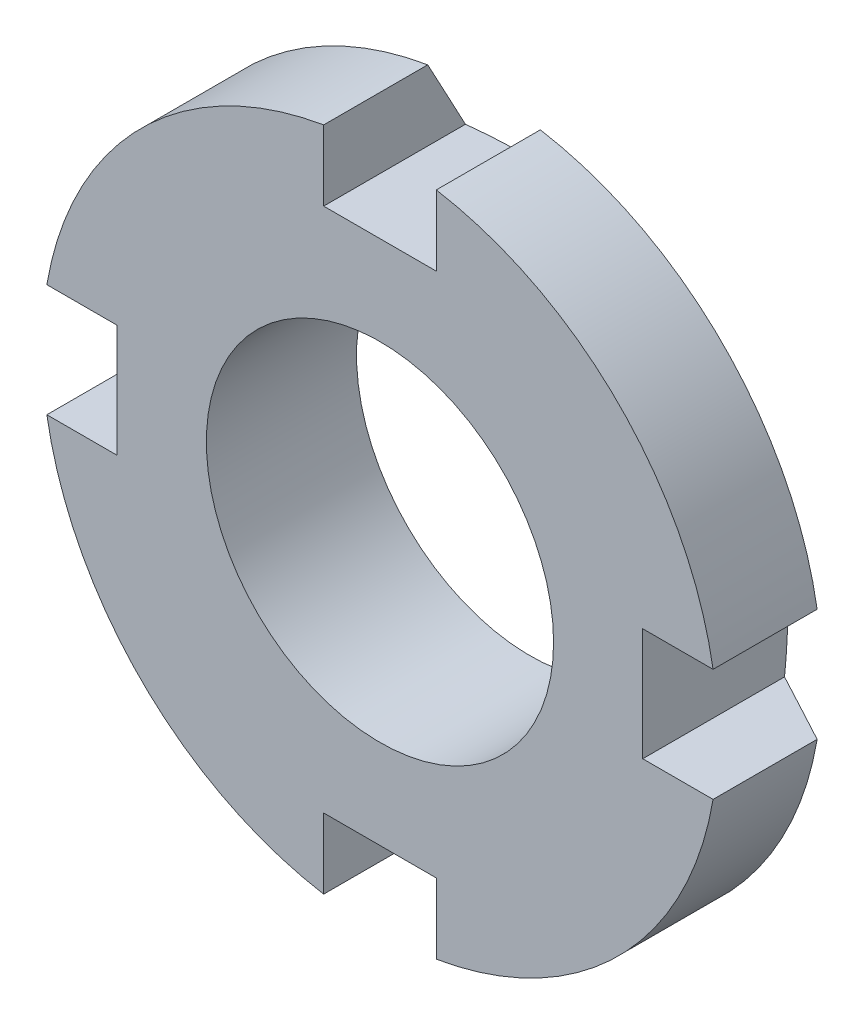
ISO-10303-21;
HEADER;
FILE_DESCRIPTION(('STEP AP214'),'2;1');
FILE_NAME('part.step','',(''),(''),'','','');
FILE_SCHEMA(('AUTOMOTIVE_DESIGN { 1 0 10303 214 1 1 1 1 }'));
ENDSEC;
DATA;
#1=APPLICATION_CONTEXT('core data for automotive mechanical design processes');
#2=APPLICATION_PROTOCOL_DEFINITION('international standard','automotive_design',2000,#1);
#3=PRODUCT_CONTEXT('',#1,'mechanical');
#4=PRODUCT('Part','Part','',(#3));
#5=PRODUCT_RELATED_PRODUCT_CATEGORY('part','',(#4));
#6=PRODUCT_DEFINITION_FORMATION('','',#4);
#7=PRODUCT_DEFINITION_CONTEXT('part definition',#1,'design');
#8=PRODUCT_DEFINITION('design','',#6,#7);
#9=PRODUCT_DEFINITION_SHAPE('','',#8);
#10=(LENGTH_UNIT() NAMED_UNIT(*) SI_UNIT(.MILLI.,.METRE.));
#11=(NAMED_UNIT(*) PLANE_ANGLE_UNIT() SI_UNIT($,.RADIAN.));
#12=(NAMED_UNIT(*) SI_UNIT($,.STERADIAN.) SOLID_ANGLE_UNIT());
#13=UNCERTAINTY_MEASURE_WITH_UNIT(LENGTH_MEASURE(1.E-05),#10,'distance_accuracy_value','');
#14=(GEOMETRIC_REPRESENTATION_CONTEXT(3) GLOBAL_UNCERTAINTY_ASSIGNED_CONTEXT((#13)) GLOBAL_UNIT_ASSIGNED_CONTEXT((#10,
#11,#12)) REPRESENTATION_CONTEXT('',''));
#15=CARTESIAN_POINT('',(0.,0.,0.));
#16=DIRECTION('',(0.,0.,1.));
#17=DIRECTION('',(1.,0.,0.));
#18=AXIS2_PLACEMENT_3D('',#15,#16,#17);
#19=CARTESIAN_POINT('',(0.,0.,4.));
#20=DIRECTION('',(0.,0.,-1.));
#21=DIRECTION('',(-1.,0.,0.));
#22=AXIS2_PLACEMENT_3D('',#19,#20,#21);
#23=CYLINDRICAL_SURFACE('',#22,9.);
#24=CARTESIAN_POINT('',(0.,0.,1.22773147415524));
#25=DIRECTION('',(0.,0.,1.));
#26=DIRECTION('',(1.,0.,0.));
#27=AXIS2_PLACEMENT_3D('',#24,#25,#26);
#28=CIRCLE('',#27,9.);
#29=CARTESIAN_POINT('',(8.87411967464943,1.49999999999997,1.22773147415524));
#30=VERTEX_POINT('',#29);
#31=CARTESIAN_POINT('',(1.5,8.87411967464942,1.22773147415524));
#32=VERTEX_POINT('',#31);
#33=EDGE_CURVE('E158',#30,#32,#28,.T.);
#34=ORIENTED_EDGE('',*,*,#33,.T.);
#35=DIRECTION('',(0.,0.,-1.));
#36=VECTOR('',#35,1.);
#37=CARTESIAN_POINT('',(1.5,8.87411967464942,4.));
#38=LINE('',#37,#36);
#39=CARTESIAN_POINT('',(1.5,8.87411967464942,4.));
#40=VERTEX_POINT('',#39);
#41=EDGE_CURVE('E237',#32,#40,#38,.F.);
#42=ORIENTED_EDGE('',*,*,#41,.T.);
#43=CARTESIAN_POINT('',(0.,0.,4.));
#44=DIRECTION('',(0.,0.,1.));
#45=DIRECTION('',(1.,0.,0.));
#46=AXIS2_PLACEMENT_3D('',#43,#44,#45);
#47=CIRCLE('',#46,9.);
#48=CARTESIAN_POINT('',(8.87411967464943,1.49999999999997,4.));
#49=VERTEX_POINT('',#48);
#50=EDGE_CURVE('E181',#49,#40,#47,.T.);
#51=ORIENTED_EDGE('',*,*,#50,.F.);
#52=DIRECTION('',(0.,0.,-1.));
#53=VECTOR('',#52,1.);
#54=CARTESIAN_POINT('',(8.87411967464943,1.49999999999997,4.));
#55=LINE('',#54,#53);
#56=EDGE_CURVE('E173',#49,#30,#55,.T.);
#57=ORIENTED_EDGE('',*,*,#56,.T.);
#58=EDGE_LOOP('',(#34,#42,#51,#57));
#59=FACE_BOUND('',#58,.T.);
#60=ADVANCED_FACE('F41',(#59),#23,.T.);
#61=CARTESIAN_POINT('',(1.5,-8.87411967464942,1.22773147415524));
#62=VERTEX_POINT('',#61);
#63=CARTESIAN_POINT('',(8.87411967464942,-1.50000000000003,1.22773147415524));
#64=VERTEX_POINT('',#63);
#65=EDGE_CURVE('E168',#62,#64,#28,.T.);
#66=ORIENTED_EDGE('',*,*,#65,.T.);
#67=DIRECTION('',(0.,0.,-1.));
#68=VECTOR('',#67,1.);
#69=CARTESIAN_POINT('',(8.87411967464942,-1.50000000000003,4.));
#70=LINE('',#69,#68);
#71=CARTESIAN_POINT('',(8.87411967464942,-1.50000000000003,4.));
#72=VERTEX_POINT('',#71);
#73=EDGE_CURVE('E187',#64,#72,#70,.F.);
#74=ORIENTED_EDGE('',*,*,#73,.T.);
#75=CARTESIAN_POINT('',(1.5,-8.87411967464942,4.));
#76=VERTEX_POINT('',#75);
#77=EDGE_CURVE('E246',#76,#72,#47,.T.);
#78=ORIENTED_EDGE('',*,*,#77,.F.);
#79=DIRECTION('',(0.,0.,-1.));
#80=VECTOR('',#79,1.);
#81=CARTESIAN_POINT('',(1.5,-8.87411967464942,4.));
#82=LINE('',#81,#80);
#83=EDGE_CURVE('E207',#76,#62,#82,.T.);
#84=ORIENTED_EDGE('',*,*,#83,.T.);
#85=EDGE_LOOP('',(#66,#74,#78,#84));
#86=FACE_BOUND('',#85,.T.);
#87=ADVANCED_FACE('F259',(#86),#23,.T.);
#88=CARTESIAN_POINT('',(-8.87411967464944,-1.49999999999991,1.22773147415524));
#89=VERTEX_POINT('',#88);
#90=CARTESIAN_POINT('',(-1.5,-8.87411967464942,1.22773147415524));
#91=VERTEX_POINT('',#90);
#92=EDGE_CURVE('E420',#89,#91,#28,.T.);
#93=ORIENTED_EDGE('',*,*,#92,.T.);
#94=DIRECTION('',(0.,0.,-1.));
#95=VECTOR('',#94,1.);
#96=CARTESIAN_POINT('',(-1.5,-8.87411967464942,4.));
#97=LINE('',#96,#95);
#98=CARTESIAN_POINT('',(-1.5,-8.87411967464942,4.));
#99=VERTEX_POINT('',#98);
#100=EDGE_CURVE('E202',#91,#99,#97,.F.);
#101=ORIENTED_EDGE('',*,*,#100,.T.);
#102=CARTESIAN_POINT('',(-8.87411967464944,-1.49999999999991,4.));
#103=VERTEX_POINT('',#102);
#104=EDGE_CURVE('E241',#103,#99,#47,.T.);
#105=ORIENTED_EDGE('',*,*,#104,.F.);
#106=DIRECTION('',(0.,0.,-1.));
#107=VECTOR('',#106,1.);
#108=CARTESIAN_POINT('',(-8.87411967464944,-1.49999999999991,4.));
#109=LINE('',#108,#107);
#110=EDGE_CURVE('E195',#103,#89,#109,.T.);
#111=ORIENTED_EDGE('',*,*,#110,.T.);
#112=EDGE_LOOP('',(#93,#101,#105,#111));
#113=FACE_BOUND('',#112,.T.);
#114=ADVANCED_FACE('F410',(#113),#23,.T.);
#115=CARTESIAN_POINT('',(-1.5,8.87411967464942,1.22773147415524));
#116=VERTEX_POINT('',#115);
#117=CARTESIAN_POINT('',(-8.87411967464941,1.50000000000009,1.22773147415524));
#118=VERTEX_POINT('',#117);
#119=EDGE_CURVE('E166',#116,#118,#28,.T.);
#120=ORIENTED_EDGE('',*,*,#119,.T.);
#121=DIRECTION('',(0.,0.,-1.));
#122=VECTOR('',#121,1.);
#123=CARTESIAN_POINT('',(-8.87411967464941,1.50000000000009,4.));
#124=LINE('',#123,#122);
#125=CARTESIAN_POINT('',(-8.87411967464941,1.50000000000009,4.));
#126=VERTEX_POINT('',#125);
#127=EDGE_CURVE('E222',#118,#126,#124,.F.);
#128=ORIENTED_EDGE('',*,*,#127,.T.);
#129=CARTESIAN_POINT('',(-1.5,8.87411967464942,4.));
#130=VERTEX_POINT('',#129);
#131=EDGE_CURVE('E54',#130,#126,#47,.T.);
#132=ORIENTED_EDGE('',*,*,#131,.F.);
#133=DIRECTION('',(0.,0.,-1.));
#134=VECTOR('',#133,1.);
#135=CARTESIAN_POINT('',(-1.5,8.87411967464942,4.));
#136=LINE('',#135,#134);
#137=EDGE_CURVE('E68',#130,#116,#136,.T.);
#138=ORIENTED_EDGE('',*,*,#137,.T.);
#139=EDGE_LOOP('',(#120,#128,#132,#138));
#140=FACE_BOUND('',#139,.T.);
#141=ADVANCED_FACE('F406',(#140),#23,.T.);
#142=CARTESIAN_POINT('',(-1.5,9.,0.));
#143=DIRECTION('',(-1.,0.,0.));
#144=DIRECTION('',(0.,0.,1.));
#145=AXIS2_PLACEMENT_3D('',#142,#143,#144);
#146=PLANE('',#145);
#147=CARTESIAN_POINT('',(-1.5,11.1147770225004,2.43665787458032));
#148=CARTESIAN_POINT('',(-1.5,10.8506556267786,2.29383333471043));
#149=CARTESIAN_POINT('',(-1.5,10.5864971014101,2.15107751910792));
#150=CARTESIAN_POINT('',(-1.5,10.0580846010182,1.86574219561681));
#151=CARTESIAN_POINT('',(-1.5,9.79383062592461,1.72316268785826));
#152=CARTESIAN_POINT('',(-1.5,9.00090068717073,1.29575066054291));
#153=CARTESIAN_POINT('',(-1.5,8.47205035311945,1.01124119699912));
#154=CARTESIAN_POINT('',(-1.5,7.67817594716345,0.585585186568665));
#155=CARTESIAN_POINT('',(-1.5,7.41344956052434,0.443883606077837));
#156=CARTESIAN_POINT('',(-1.5,6.88372268162724,0.16099486320502));
#157=CARTESIAN_POINT('',(-1.5,6.61872218989854,0.0198076998320743));
#158=CARTESIAN_POINT('',(-1.5,6.08834294315433,-0.261863382738055));
#159=CARTESIAN_POINT('',(-1.5,5.82296418353143,-0.40234729327378));
#160=CARTESIAN_POINT('',(-1.5,5.29163272256947,-0.682229224875833));
#161=CARTESIAN_POINT('',(-1.5,5.02568001739623,-0.821627238659087));
#162=CARTESIAN_POINT('',(-1.5,4.75934265214902,-0.960290909987764));
#163=B_SPLINE_CURVE_WITH_KNOTS('',3,(#147,#148,#149,#150,#151,#152,#153,#154,#155,#156,#157,
#158,#159,#160,#161,#162),.UNSPECIFIED.,.F.,.F.,(4,2,2,2,2,2,2,4),(0.,0.900794369729252,
1.80158940352291,3.60315778719345,4.50395399200186,5.40474846062694,6.30555399652662,
7.20636556890652),.UNSPECIFIED.);
#164=CARTESIAN_POINT('',(-1.5,7.,0.223125479913663));
#165=VERTEX_POINT('',#164);
#166=EDGE_CURVE('E215',#116,#165,#163,.T.);
#167=ORIENTED_EDGE('',*,*,#166,.F.);
#168=ORIENTED_EDGE('',*,*,#137,.F.);
#169=DIRECTION('',(0.,-1.,0.));
#170=VECTOR('',#169,1.);
#171=CARTESIAN_POINT('',(-1.5,9.,4.));
#172=LINE('',#171,#170);
#173=CARTESIAN_POINT('',(-1.5,7.,4.));
#174=VERTEX_POINT('',#173);
#175=EDGE_CURVE('E182',#130,#174,#172,.T.);
#176=ORIENTED_EDGE('',*,*,#175,.T.);
#177=DIRECTION('',(0.,0.,1.));
#178=VECTOR('',#177,1.);
#179=CARTESIAN_POINT('',(-1.5,7.,0.));
#180=LINE('',#179,#178);
#181=EDGE_CURVE('E234',#165,#174,#180,.T.);
#182=ORIENTED_EDGE('',*,*,#181,.F.);
#183=EDGE_LOOP('',(#167,#168,#176,#182));
#184=FACE_BOUND('',#183,.T.);
#185=ADVANCED_FACE('F284',(#184),#146,.F.);
#186=CARTESIAN_POINT('',(1.5,9.,0.));
#187=DIRECTION('',(1.,0.,0.));
#188=DIRECTION('',(0.,0.,-1.));
#189=AXIS2_PLACEMENT_3D('',#186,#187,#188);
#190=PLANE('',#189);
#191=CARTESIAN_POINT('',(1.5,4.75934265214902,-0.960290909987764));
#192=CARTESIAN_POINT('',(1.5,4.95578918182487,-0.858036285909096));
#193=CARTESIAN_POINT('',(1.5,5.15201710541849,-0.755363412477248));
#194=CARTESIAN_POINT('',(1.5,5.54412843523637,-0.549363653967655));
#195=CARTESIAN_POINT('',(1.5,5.74001184290889,-0.44603677164763));
#196=CARTESIAN_POINT('',(1.5,6.13152664907411,-0.238911591336168));
#197=CARTESIAN_POINT('',(1.5,6.32715804991903,-0.135113297786346));
#198=CARTESIAN_POINT('',(1.5,6.71822687212564,0.0728485538114658));
#199=CARTESIAN_POINT('',(1.5,6.91366429325136,0.17701211230313));
#200=CARTESIAN_POINT('',(1.5,7.49974627793163,0.489920531797444));
#201=CARTESIAN_POINT('',(1.5,7.89016617098705,0.69908611036567));
#202=CARTESIAN_POINT('',(1.5,8.67062293114549,1.11813212576168));
#203=CARTESIAN_POINT('',(1.5,9.06065979736414,1.32801256423503));
#204=CARTESIAN_POINT('',(1.5,9.72804830001477,1.68767682343232));
#205=CARTESIAN_POINT('',(1.5,10.0054649682038,1.83734000653831));
#206=CARTESIAN_POINT('',(1.5,10.5601932624885,2.13686376678938));
#207=CARTESIAN_POINT('',(1.5,10.8375048881298,2.28672434477614));
#208=CARTESIAN_POINT('',(1.5,11.1147770225004,2.43665787458032));
#209=B_SPLINE_CURVE_WITH_KNOTS('',3,(#191,#192,#193,#194,#195,#196,#197,#198,#199,#200,#201,
#202,#203,#204,#205,#206,#207,#208),.UNSPECIFIED.,.F.,.F.,(4,2,2,2,2,2,2,2,4),(0.,
0.664396750021165,1.3287907003839,1.99317840378869,2.65756691448013,3.98632489271573,
5.31508593173237,6.26072409237568,7.20636629829587),.UNSPECIFIED.);
#210=CARTESIAN_POINT('',(1.50000000000005,7.,0.223125479913541));
#211=VERTEX_POINT('',#210);
#212=EDGE_CURVE('E161',#211,#32,#209,.T.);
#213=ORIENTED_EDGE('',*,*,#212,.F.);
#214=DIRECTION('',(0.,0.,1.));
#215=VECTOR('',#214,1.);
#216=CARTESIAN_POINT('',(1.5,7.,0.));
#217=LINE('',#216,#215);
#218=CARTESIAN_POINT('',(1.5,7.,4.));
#219=VERTEX_POINT('',#218);
#220=EDGE_CURVE('E235',#211,#219,#217,.T.);
#221=ORIENTED_EDGE('',*,*,#220,.T.);
#222=DIRECTION('',(0.,1.,0.));
#223=VECTOR('',#222,1.);
#224=CARTESIAN_POINT('',(1.5,9.,4.));
#225=LINE('',#224,#223);
#226=EDGE_CURVE('E231',#219,#40,#225,.T.);
#227=ORIENTED_EDGE('',*,*,#226,.T.);
#228=ORIENTED_EDGE('',*,*,#41,.F.);
#229=EDGE_LOOP('',(#213,#221,#227,#228));
#230=FACE_BOUND('',#229,.T.);
#231=ADVANCED_FACE('F369',(#230),#190,.F.);
#232=CARTESIAN_POINT('',(-1.5,7.,0.));
#233=DIRECTION('',(0.,-1.,0.));
#234=DIRECTION('',(1.,0.,0.));
#235=AXIS2_PLACEMENT_3D('',#232,#233,#234);
#236=PLANE('',#235);
#237=CARTESIAN_POINT('',(-4.74170035826489,7.,0.930241053757662));
#238=CARTESIAN_POINT('',(-4.51661766252816,7.,0.861389439687649));
#239=CARTESIAN_POINT('',(-4.29062245850839,7.,0.795567166900741));
#240=CARTESIAN_POINT('',(-3.83652224804282,7.,0.671148152115301));
#241=CARTESIAN_POINT('',(-3.60841613048296,7.,0.612555479008985));
#242=CARTESIAN_POINT('',(-2.91938608907934,7.,0.449130597756766));
#243=CARTESIAN_POINT('',(-2.45522002170282,7.,0.35711763581486));
#244=CARTESIAN_POINT('',(-1.76121125698983,7.,0.253655706299638));
#245=CARTESIAN_POINT('',(-1.53385720237715,7.,0.225123729975927));
#246=CARTESIAN_POINT('',(-1.07797227028221,7.,0.179507495416929));
#247=CARTESIAN_POINT('',(-0.84944136763656,7.,0.162423482994938));
#248=CARTESIAN_POINT('',(-0.392222796727265,7.,0.140391800967802));
#249=CARTESIAN_POINT('',(-0.163536242920058,7.,0.135421233014639));
#250=CARTESIAN_POINT('',(0.293755153933356,7.,0.137738430363595));
#251=CARTESIAN_POINT('',(0.52236000033577,7.,0.145025615260545));
#252=CARTESIAN_POINT('',(1.08560351675086,7.,0.177810169223396));
#253=CARTESIAN_POINT('',(1.41985430671503,7.,0.210227681877856));
#254=CARTESIAN_POINT('',(2.08553601170355,7.,0.298423080432974));
#255=CARTESIAN_POINT('',(2.41696337425082,7.,0.354226925596539));
#256=CARTESIAN_POINT('',(3.08326229709133,7.,0.487009074407224));
#257=CARTESIAN_POINT('',(3.41804321475655,7.,0.564436124824867));
#258=CARTESIAN_POINT('',(3.91688669729832,7.,0.692990371010778));
#259=CARTESIAN_POINT('',(4.08259436039717,7.,0.737904857972981));
#260=CARTESIAN_POINT('',(4.41293329284712,7.,0.831419026121075));
#261=CARTESIAN_POINT('',(4.57756476629598,7.,0.880017985148833));
#262=CARTESIAN_POINT('',(4.74170035826489,7.,0.930241053757661));
#263=B_SPLINE_CURVE_WITH_KNOTS('',3,(#237,#238,#239,#240,#241,#242,#243,#244,#245,#246,#247,
#248,#249,#250,#251,#252,#253,#254,#255,#256,#257,#258,#259,#260,#261,#262),.UNSPECIFIED.,.F.,
.F.,(4,2,2,2,2,2,2,2,2,2,2,2,4),(0.,0.706064845806198,1.41252527685223,2.83006261147122,
3.51723845542402,4.20442905410072,4.89031962806356,5.57617772598988,6.58264694036958,
7.59023632582544,8.62052736446333,9.13555454384541,9.6504810373584),.UNSPECIFIED.);
#264=EDGE_CURVE('E360',#165,#211,#263,.T.);
#265=ORIENTED_EDGE('',*,*,#264,.F.);
#266=ORIENTED_EDGE('',*,*,#181,.T.);
#267=DIRECTION('',(1.,0.,0.));
#268=VECTOR('',#267,1.);
#269=CARTESIAN_POINT('',(-1.5,7.,4.));
#270=LINE('',#269,#268);
#271=EDGE_CURVE('E185',#174,#219,#270,.T.);
#272=ORIENTED_EDGE('',*,*,#271,.T.);
#273=ORIENTED_EDGE('',*,*,#220,.F.);
#274=EDGE_LOOP('',(#265,#266,#272,#273));
#275=FACE_BOUND('',#274,.T.);
#276=ADVANCED_FACE('F365',(#275),#236,.F.);
#277=CARTESIAN_POINT('',(-9.00000000000001,-1.49999999999991,0.));
#278=DIRECTION('',(0.,-1.,0.));
#279=DIRECTION('',(0.,0.,1.));
#280=AXIS2_PLACEMENT_3D('',#277,#278,#279);
#281=PLANE('',#280);
#282=CARTESIAN_POINT('',(-11.1147770225004,-1.49999999999988,2.43665787458032));
#283=CARTESIAN_POINT('',(-10.8506556267786,-1.49999999999989,2.29383333471043));
#284=CARTESIAN_POINT('',(-10.5864971014101,-1.49999999999989,2.15107751910792));
#285=CARTESIAN_POINT('',(-10.0580846010182,-1.49999999999989,1.86574219561681));
#286=CARTESIAN_POINT('',(-9.79383062592462,-1.4999999999999,1.72316268785826));
#287=CARTESIAN_POINT('',(-9.00090068717074,-1.49999999999991,1.29575066054291));
#288=CARTESIAN_POINT('',(-8.47205035311946,-1.49999999999991,1.01124119699912));
#289=CARTESIAN_POINT('',(-7.67817594716347,-1.49999999999992,0.585585186568665));
#290=CARTESIAN_POINT('',(-7.41344956052436,-1.49999999999992,0.443883606077837));
#291=CARTESIAN_POINT('',(-6.88372268162725,-1.49999999999993,0.16099486320502));
#292=CARTESIAN_POINT('',(-6.61872218989855,-1.49999999999993,0.0198076998320744));
#293=CARTESIAN_POINT('',(-6.08834294315434,-1.49999999999994,-0.261863382738055));
#294=CARTESIAN_POINT('',(-5.82296418353144,-1.49999999999994,-0.402347293273781));
#295=CARTESIAN_POINT('',(-5.29163272256949,-1.49999999999994,-0.682229224875834));
#296=CARTESIAN_POINT('',(-5.02568001739625,-1.49999999999995,-0.821627238659088));
#297=CARTESIAN_POINT('',(-4.75934265214904,-1.49999999999995,-0.960290909987764));
#298=B_SPLINE_CURVE_WITH_KNOTS('',3,(#282,#283,#284,#285,#286,#287,#288,#289,#290,#291,#292,
#293,#294,#295,#296,#297),.UNSPECIFIED.,.F.,.F.,(4,2,2,2,2,2,2,4),(0.,0.900794369729252,
1.80158940352291,3.60315778719345,4.50395399200186,5.40474846062694,6.30555399652662,
7.20636556890652),.UNSPECIFIED.);
#299=CARTESIAN_POINT('',(-7.00000000000002,-1.49999999999993,0.223125479913663));
#300=VERTEX_POINT('',#299);
#301=EDGE_CURVE('E354',#89,#300,#298,.T.);
#302=ORIENTED_EDGE('',*,*,#301,.F.);
#303=ORIENTED_EDGE('',*,*,#110,.F.);
#304=DIRECTION('',(1.,0.,0.));
#305=VECTOR('',#304,1.);
#306=CARTESIAN_POINT('',(-9.00000000000001,-1.49999999999991,4.));
#307=LINE('',#306,#305);
#308=CARTESIAN_POINT('',(-7.00000000000002,-1.49999999999993,4.));
#309=VERTEX_POINT('',#308);
#310=EDGE_CURVE('E224',#103,#309,#307,.T.);
#311=ORIENTED_EDGE('',*,*,#310,.T.);
#312=DIRECTION('',(0.,0.,1.));
#313=VECTOR('',#312,1.);
#314=CARTESIAN_POINT('',(-7.00000000000002,-1.49999999999993,0.));
#315=LINE('',#314,#313);
#316=EDGE_CURVE('E217',#300,#309,#315,.T.);
#317=ORIENTED_EDGE('',*,*,#316,.F.);
#318=EDGE_LOOP('',(#302,#303,#311,#317));
#319=FACE_BOUND('',#318,.T.);
#320=ADVANCED_FACE('F368',(#319),#281,.F.);
#321=CARTESIAN_POINT('',(-8.99999999999998,1.50000000000009,0.));
#322=DIRECTION('',(0.,1.,0.));
#323=DIRECTION('',(0.,0.,-1.));
#324=AXIS2_PLACEMENT_3D('',#321,#322,#323);
#325=PLANE('',#324);
#326=CARTESIAN_POINT('',(-4.759342652149,1.50000000000005,-0.960290909987764));
#327=CARTESIAN_POINT('',(-4.95578918182485,1.50000000000005,-0.858036285909096));
#328=CARTESIAN_POINT('',(-5.15201710541848,1.50000000000005,-0.755363412477248));
#329=CARTESIAN_POINT('',(-5.54412843523636,1.50000000000006,-0.549363653967655));
#330=CARTESIAN_POINT('',(-5.74001184290887,1.50000000000006,-0.44603677164763));
#331=CARTESIAN_POINT('',(-6.1315266490741,1.50000000000006,-0.238911591336168));
#332=CARTESIAN_POINT('',(-6.32715804991901,1.50000000000007,-0.135113297786346));
#333=CARTESIAN_POINT('',(-6.71822687212563,1.50000000000007,0.0728485538114657));
#334=CARTESIAN_POINT('',(-6.91366429325134,1.50000000000007,0.17701211230313));
#335=CARTESIAN_POINT('',(-7.49974627793161,1.50000000000008,0.489920531797444));
#336=CARTESIAN_POINT('',(-7.89016617098703,1.50000000000008,0.69908611036567));
#337=CARTESIAN_POINT('',(-8.67062293114547,1.50000000000009,1.11813212576168));
#338=CARTESIAN_POINT('',(-9.06065979736412,1.5000000000001,1.32801256423503));
#339=CARTESIAN_POINT('',(-9.72804830001476,1.5000000000001,1.68767682343232));
#340=CARTESIAN_POINT('',(-10.0054649682038,1.50000000000011,1.83734000653831));
#341=CARTESIAN_POINT('',(-10.5601932624885,1.50000000000011,2.13686376678938));
#342=CARTESIAN_POINT('',(-10.8375048881298,1.50000000000011,2.28672434477614));
#343=CARTESIAN_POINT('',(-11.1147770225004,1.50000000000012,2.43665787458032));
#344=B_SPLINE_CURVE_WITH_KNOTS('',3,(#326,#327,#328,#329,#330,#331,#332,#333,#334,#335,#336,
#337,#338,#339,#340,#341,#342,#343),.UNSPECIFIED.,.F.,.F.,(4,2,2,2,2,2,2,2,4),(0.,
0.664396750021164,1.3287907003839,1.99317840378869,2.65756691448013,3.98632489271573,
5.31508593173237,6.26072409237568,7.20636629829587),.UNSPECIFIED.);
#345=CARTESIAN_POINT('',(-6.99999999999998,1.50000000000012,0.223125479913541));
#346=VERTEX_POINT('',#345);
#347=EDGE_CURVE('E346',#346,#118,#344,.T.);
#348=ORIENTED_EDGE('',*,*,#347,.F.);
#349=DIRECTION('',(0.,0.,1.));
#350=VECTOR('',#349,1.);
#351=CARTESIAN_POINT('',(-6.99999999999998,1.50000000000007,0.));
#352=LINE('',#351,#350);
#353=CARTESIAN_POINT('',(-6.99999999999998,1.50000000000007,4.));
#354=VERTEX_POINT('',#353);
#355=EDGE_CURVE('E214',#346,#354,#352,.T.);
#356=ORIENTED_EDGE('',*,*,#355,.T.);
#357=DIRECTION('',(-1.,0.,0.));
#358=VECTOR('',#357,1.);
#359=CARTESIAN_POINT('',(-8.99999999999998,1.50000000000009,4.));
#360=LINE('',#359,#358);
#361=EDGE_CURVE('E219',#354,#126,#360,.T.);
#362=ORIENTED_EDGE('',*,*,#361,.T.);
#363=ORIENTED_EDGE('',*,*,#127,.F.);
#364=EDGE_LOOP('',(#348,#356,#362,#363));
#365=FACE_BOUND('',#364,.T.);
#366=ADVANCED_FACE('F376',(#365),#325,.F.);
#367=CARTESIAN_POINT('',(-7.00000000000002,-1.49999999999993,0.));
#368=DIRECTION('',(1.,0.,0.));
#369=DIRECTION('',(0.,1.,0.));
#370=AXIS2_PLACEMENT_3D('',#367,#368,#369);
#371=PLANE('',#370);
#372=CARTESIAN_POINT('',(-7.00000000000005,-4.74170035826481,0.930241053757662));
#373=CARTESIAN_POINT('',(-7.00000000000005,-4.51661766252809,0.861389439687648));
#374=CARTESIAN_POINT('',(-7.00000000000005,-4.29062245850832,0.795567166900741));
#375=CARTESIAN_POINT('',(-7.00000000000004,-3.83652224804274,0.671148152115301));
#376=CARTESIAN_POINT('',(-7.00000000000004,-3.60841613048289,0.612555479008985));
#377=CARTESIAN_POINT('',(-7.00000000000003,-2.91938608907927,0.449130597756766));
#378=CARTESIAN_POINT('',(-7.00000000000002,-2.45522002170275,0.357117635814861));
#379=CARTESIAN_POINT('',(-7.00000000000002,-1.76121125698976,0.253655706299639));
#380=CARTESIAN_POINT('',(-7.00000000000002,-1.53385720237708,0.225123729975927));
#381=CARTESIAN_POINT('',(-7.00000000000001,-1.07797227028214,0.179507495416929));
#382=CARTESIAN_POINT('',(-7.00000000000001,-0.849441367636488,0.162423482994938));
#383=CARTESIAN_POINT('',(-7.,-0.392222796727193,0.140391800967802));
#384=CARTESIAN_POINT('',(-7.,-0.163536242919985,0.135421233014639));
#385=CARTESIAN_POINT('',(-7.,0.293755153933428,0.137738430363595));
#386=CARTESIAN_POINT('',(-6.99999999999999,0.522360000335842,0.145025615260545));
#387=CARTESIAN_POINT('',(-6.99999999999999,1.08560351675093,0.177810169223396));
#388=CARTESIAN_POINT('',(-6.99999999999998,1.41985430671511,0.210227681877855));
#389=CARTESIAN_POINT('',(-6.99999999999998,2.08553601170362,0.298423080432973));
#390=CARTESIAN_POINT('',(-6.99999999999997,2.41696337425089,0.354226925596538));
#391=CARTESIAN_POINT('',(-6.99999999999997,3.0832622970914,0.487009074407224));
#392=CARTESIAN_POINT('',(-6.99999999999996,3.41804321475663,0.564436124824867));
#393=CARTESIAN_POINT('',(-6.99999999999996,3.9168866972984,0.692990371010778));
#394=CARTESIAN_POINT('',(-6.99999999999996,4.08259436039725,0.737904857972981));
#395=CARTESIAN_POINT('',(-6.99999999999995,4.41293329284719,0.831419026121075));
#396=CARTESIAN_POINT('',(-6.99999999999995,4.57756476629605,0.880017985148833));
#397=CARTESIAN_POINT('',(-6.99999999999995,4.74170035826496,0.930241053757661));
#398=B_SPLINE_CURVE_WITH_KNOTS('',3,(#372,#373,#374,#375,#376,#377,#378,#379,#380,#381,#382,
#383,#384,#385,#386,#387,#388,#389,#390,#391,#392,#393,#394,#395,#396,#397),.UNSPECIFIED.,.F.,
.F.,(4,2,2,2,2,2,2,2,2,2,2,2,4),(0.,0.706064845806199,1.41252527685223,2.83006261147122,
3.51723845542402,4.20442905410072,4.89031962806356,5.57617772598988,6.58264694036958,
7.59023632582544,8.62052736446333,9.13555454384541,9.65048103735839),.UNSPECIFIED.);
#399=EDGE_CURVE('E338',#300,#346,#398,.T.);
#400=ORIENTED_EDGE('',*,*,#399,.F.);
#401=ORIENTED_EDGE('',*,*,#316,.T.);
#402=DIRECTION('',(0.,1.,0.));
#403=VECTOR('',#402,1.);
#404=CARTESIAN_POINT('',(-7.00000000000002,-1.49999999999993,4.));
#405=LINE('',#404,#403);
#406=EDGE_CURVE('E211',#309,#354,#405,.T.);
#407=ORIENTED_EDGE('',*,*,#406,.T.);
#408=ORIENTED_EDGE('',*,*,#355,.F.);
#409=EDGE_LOOP('',(#400,#401,#407,#408));
#410=FACE_BOUND('',#409,.T.);
#411=ADVANCED_FACE('F380',(#410),#371,.F.);
#412=CARTESIAN_POINT('',(1.5,-9.,0.));
#413=DIRECTION('',(1.,0.,0.));
#414=DIRECTION('',(0.,0.,1.));
#415=AXIS2_PLACEMENT_3D('',#412,#413,#414);
#416=PLANE('',#415);
#417=CARTESIAN_POINT('',(1.5,-11.1147770225004,2.43665787458032));
#418=CARTESIAN_POINT('',(1.5,-10.8506556267786,2.29383333471043));
#419=CARTESIAN_POINT('',(1.5,-10.5864971014101,2.15107751910792));
#420=CARTESIAN_POINT('',(1.5,-10.0580846010182,1.86574219561681));
#421=CARTESIAN_POINT('',(1.5,-9.79383062592461,1.72316268785826));
#422=CARTESIAN_POINT('',(1.5,-9.00090068717073,1.29575066054291));
#423=CARTESIAN_POINT('',(1.5,-8.47205035311945,1.01124119699912));
#424=CARTESIAN_POINT('',(1.5,-7.67817594716345,0.585585186568665));
#425=CARTESIAN_POINT('',(1.5,-7.41344956052434,0.443883606077837));
#426=CARTESIAN_POINT('',(1.5,-6.88372268162724,0.16099486320502));
#427=CARTESIAN_POINT('',(1.5,-6.61872218989854,0.0198076998320743));
#428=CARTESIAN_POINT('',(1.5,-6.08834294315433,-0.261863382738055));
#429=CARTESIAN_POINT('',(1.5,-5.82296418353143,-0.40234729327378));
#430=CARTESIAN_POINT('',(1.5,-5.29163272256947,-0.682229224875833));
#431=CARTESIAN_POINT('',(1.5,-5.02568001739623,-0.821627238659087));
#432=CARTESIAN_POINT('',(1.5,-4.75934265214902,-0.960290909987764));
#433=B_SPLINE_CURVE_WITH_KNOTS('',3,(#417,#418,#419,#420,#421,#422,#423,#424,#425,#426,#427,
#428,#429,#430,#431,#432),.UNSPECIFIED.,.F.,.F.,(4,2,2,2,2,2,2,4),(0.,0.900794369729252,
1.80158940352291,3.60315778719345,4.50395399200186,5.40474846062694,6.30555399652662,
7.20636556890652),.UNSPECIFIED.);
#434=CARTESIAN_POINT('',(1.5,-7.,0.223125479913663));
#435=VERTEX_POINT('',#434);
#436=EDGE_CURVE('E330',#62,#435,#433,.T.);
#437=ORIENTED_EDGE('',*,*,#436,.F.);
#438=ORIENTED_EDGE('',*,*,#83,.F.);
#439=DIRECTION('',(0.,1.,0.));
#440=VECTOR('',#439,1.);
#441=CARTESIAN_POINT('',(1.5,-9.,4.));
#442=LINE('',#441,#440);
#443=CARTESIAN_POINT('',(1.5,-7.,4.));
#444=VERTEX_POINT('',#443);
#445=EDGE_CURVE('E204',#76,#444,#442,.T.);
#446=ORIENTED_EDGE('',*,*,#445,.T.);
#447=DIRECTION('',(0.,0.,1.));
#448=VECTOR('',#447,1.);
#449=CARTESIAN_POINT('',(1.5,-7.,0.));
#450=LINE('',#449,#448);
#451=EDGE_CURVE('E197',#435,#444,#450,.T.);
#452=ORIENTED_EDGE('',*,*,#451,.F.);
#453=EDGE_LOOP('',(#437,#438,#446,#452));
#454=FACE_BOUND('',#453,.T.);
#455=ADVANCED_FACE('F384',(#454),#416,.F.);
#456=CARTESIAN_POINT('',(-1.5,-9.,0.));
#457=DIRECTION('',(-1.,0.,0.));
#458=DIRECTION('',(0.,0.,-1.));
#459=AXIS2_PLACEMENT_3D('',#456,#457,#458);
#460=PLANE('',#459);
#461=CARTESIAN_POINT('',(-1.5,-4.75934265214902,-0.960290909987764));
#462=CARTESIAN_POINT('',(-1.5,-4.95578918182487,-0.858036285909096));
#463=CARTESIAN_POINT('',(-1.5,-5.15201710541849,-0.755363412477248));
#464=CARTESIAN_POINT('',(-1.5,-5.54412843523637,-0.549363653967655));
#465=CARTESIAN_POINT('',(-1.5,-5.74001184290889,-0.44603677164763));
#466=CARTESIAN_POINT('',(-1.5,-6.13152664907411,-0.238911591336168));
#467=CARTESIAN_POINT('',(-1.5,-6.32715804991903,-0.135113297786346));
#468=CARTESIAN_POINT('',(-1.5,-6.71822687212564,0.0728485538114658));
#469=CARTESIAN_POINT('',(-1.5,-6.91366429325136,0.17701211230313));
#470=CARTESIAN_POINT('',(-1.5,-7.49974627793163,0.489920531797444));
#471=CARTESIAN_POINT('',(-1.5,-7.89016617098705,0.69908611036567));
#472=CARTESIAN_POINT('',(-1.5,-8.67062293114549,1.11813212576168));
#473=CARTESIAN_POINT('',(-1.5,-9.06065979736414,1.32801256423503));
#474=CARTESIAN_POINT('',(-1.5,-9.72804830001477,1.68767682343232));
#475=CARTESIAN_POINT('',(-1.5,-10.0054649682038,1.83734000653831));
#476=CARTESIAN_POINT('',(-1.5,-10.5601932624885,2.13686376678938));
#477=CARTESIAN_POINT('',(-1.5,-10.8375048881298,2.28672434477614));
#478=CARTESIAN_POINT('',(-1.5,-11.1147770225004,2.43665787458032));
#479=B_SPLINE_CURVE_WITH_KNOTS('',3,(#461,#462,#463,#464,#465,#466,#467,#468,#469,#470,#471,
#472,#473,#474,#475,#476,#477,#478),.UNSPECIFIED.,.F.,.F.,(4,2,2,2,2,2,2,2,4),(0.,
0.664396750021164,1.3287907003839,1.99317840378869,2.65756691448013,3.98632489271573,
5.31508593173237,6.26072409237568,7.20636629829587),.UNSPECIFIED.);
#480=CARTESIAN_POINT('',(-1.50000000000005,-7.,0.223125479913541));
#481=VERTEX_POINT('',#480);
#482=EDGE_CURVE('E322',#481,#91,#479,.T.);
#483=ORIENTED_EDGE('',*,*,#482,.F.);
#484=DIRECTION('',(0.,0.,1.));
#485=VECTOR('',#484,1.);
#486=CARTESIAN_POINT('',(-1.5,-7.,0.));
#487=LINE('',#486,#485);
#488=CARTESIAN_POINT('',(-1.5,-7.,4.));
#489=VERTEX_POINT('',#488);
#490=EDGE_CURVE('E194',#481,#489,#487,.T.);
#491=ORIENTED_EDGE('',*,*,#490,.T.);
#492=DIRECTION('',(0.,-1.,0.));
#493=VECTOR('',#492,1.);
#494=CARTESIAN_POINT('',(-1.5,-9.,4.));
#495=LINE('',#494,#493);
#496=EDGE_CURVE('E199',#489,#99,#495,.T.);
#497=ORIENTED_EDGE('',*,*,#496,.T.);
#498=ORIENTED_EDGE('',*,*,#100,.F.);
#499=EDGE_LOOP('',(#483,#491,#497,#498));
#500=FACE_BOUND('',#499,.T.);
#501=ADVANCED_FACE('F388',(#500),#460,.F.);
#502=CARTESIAN_POINT('',(1.5,-7.,0.));
#503=DIRECTION('',(0.,1.,0.));
#504=DIRECTION('',(-1.,0.,0.));
#505=AXIS2_PLACEMENT_3D('',#502,#503,#504);
#506=PLANE('',#505);
#507=CARTESIAN_POINT('',(4.74170035826489,-7.,0.930241053757662));
#508=CARTESIAN_POINT('',(4.51661766252816,-7.,0.861389439687649));
#509=CARTESIAN_POINT('',(4.29062245850839,-7.,0.795567166900741));
#510=CARTESIAN_POINT('',(3.83652224804282,-7.,0.671148152115301));
#511=CARTESIAN_POINT('',(3.60841613048296,-7.,0.612555479008985));
#512=CARTESIAN_POINT('',(2.91938608907934,-7.,0.449130597756766));
#513=CARTESIAN_POINT('',(2.45522002170282,-7.,0.35711763581486));
#514=CARTESIAN_POINT('',(1.76121125698983,-7.,0.253655706299638));
#515=CARTESIAN_POINT('',(1.53385720237715,-7.,0.225123729975927));
#516=CARTESIAN_POINT('',(1.07797227028221,-7.,0.179507495416929));
#517=CARTESIAN_POINT('',(0.84944136763656,-7.,0.162423482994938));
#518=CARTESIAN_POINT('',(0.392222796727265,-7.,0.140391800967802));
#519=CARTESIAN_POINT('',(0.163536242920058,-7.,0.135421233014639));
#520=CARTESIAN_POINT('',(-0.293755153933356,-7.,0.137738430363595));
#521=CARTESIAN_POINT('',(-0.52236000033577,-7.,0.145025615260545));
#522=CARTESIAN_POINT('',(-1.08560351675086,-7.,0.177810169223396));
#523=CARTESIAN_POINT('',(-1.41985430671503,-7.,0.210227681877856));
#524=CARTESIAN_POINT('',(-2.08553601170355,-7.,0.298423080432974));
#525=CARTESIAN_POINT('',(-2.41696337425082,-7.,0.354226925596539));
#526=CARTESIAN_POINT('',(-3.08326229709133,-7.,0.487009074407224));
#527=CARTESIAN_POINT('',(-3.41804321475655,-7.,0.564436124824867));
#528=CARTESIAN_POINT('',(-3.91688669729832,-7.,0.692990371010778));
#529=CARTESIAN_POINT('',(-4.08259436039717,-7.,0.737904857972981));
#530=CARTESIAN_POINT('',(-4.41293329284712,-7.,0.831419026121075));
#531=CARTESIAN_POINT('',(-4.57756476629598,-7.,0.880017985148833));
#532=CARTESIAN_POINT('',(-4.74170035826489,-7.,0.930241053757661));
#533=B_SPLINE_CURVE_WITH_KNOTS('',3,(#507,#508,#509,#510,#511,#512,#513,#514,#515,#516,#517,
#518,#519,#520,#521,#522,#523,#524,#525,#526,#527,#528,#529,#530,#531,#532),.UNSPECIFIED.,.F.,
.F.,(4,2,2,2,2,2,2,2,2,2,2,2,4),(0.,0.706064845806198,1.41252527685223,2.83006261147122,
3.51723845542402,4.20442905410072,4.89031962806356,5.57617772598988,6.58264694036958,
7.59023632582544,8.62052736446333,9.13555454384541,9.6504810373584),.UNSPECIFIED.);
#534=EDGE_CURVE('E176',#435,#481,#533,.T.);
#535=ORIENTED_EDGE('',*,*,#534,.F.);
#536=ORIENTED_EDGE('',*,*,#451,.T.);
#537=DIRECTION('',(-1.,0.,0.));
#538=VECTOR('',#537,1.);
#539=CARTESIAN_POINT('',(1.5,-7.,4.));
#540=LINE('',#539,#538);
#541=EDGE_CURVE('E191',#444,#489,#540,.T.);
#542=ORIENTED_EDGE('',*,*,#541,.T.);
#543=ORIENTED_EDGE('',*,*,#490,.F.);
#544=EDGE_LOOP('',(#535,#536,#542,#543));
#545=FACE_BOUND('',#544,.T.);
#546=ADVANCED_FACE('F392',(#545),#506,.F.);
#547=CARTESIAN_POINT('',(9.00000000000001,1.49999999999997,0.));
#548=DIRECTION('',(0.,1.,0.));
#549=DIRECTION('',(0.,0.,1.));
#550=AXIS2_PLACEMENT_3D('',#547,#548,#549);
#551=PLANE('',#550);
#552=CARTESIAN_POINT('',(11.1147770225004,1.49999999999996,2.43665787458032));
#553=CARTESIAN_POINT('',(10.8506556267786,1.49999999999996,2.29383333471043));
#554=CARTESIAN_POINT('',(10.5864971014101,1.49999999999996,2.15107751910792));
#555=CARTESIAN_POINT('',(10.0580846010182,1.49999999999996,1.86574219561681));
#556=CARTESIAN_POINT('',(9.79383062592461,1.49999999999997,1.72316268785826));
#557=CARTESIAN_POINT('',(9.00090068717073,1.49999999999997,1.29575066054291));
#558=CARTESIAN_POINT('',(8.47205035311945,1.49999999999997,1.01124119699912));
#559=CARTESIAN_POINT('',(7.67817594716346,1.49999999999997,0.585585186568665));
#560=CARTESIAN_POINT('',(7.41344956052435,1.49999999999997,0.443883606077837));
#561=CARTESIAN_POINT('',(6.88372268162724,1.49999999999998,0.16099486320502));
#562=CARTESIAN_POINT('',(6.61872218989854,1.49999999999998,0.0198076998320743));
#563=CARTESIAN_POINT('',(6.08834294315433,1.49999999999998,-0.261863382738056));
#564=CARTESIAN_POINT('',(5.82296418353143,1.49999999999998,-0.402347293273781));
#565=CARTESIAN_POINT('',(5.29163272256948,1.49999999999998,-0.682229224875834));
#566=CARTESIAN_POINT('',(5.02568001739624,1.49999999999998,-0.821627238659088));
#567=CARTESIAN_POINT('',(4.75934265214903,1.49999999999998,-0.960290909987764));
#568=B_SPLINE_CURVE_WITH_KNOTS('',3,(#552,#553,#554,#555,#556,#557,#558,#559,#560,#561,#562,
#563,#564,#565,#566,#567),.UNSPECIFIED.,.F.,.F.,(4,2,2,2,2,2,2,4),(0.,0.900794369729252,
1.80158940352291,3.60315778719345,4.50395399200186,5.40474846062694,6.30555399652662,
7.20636556890652),.UNSPECIFIED.);
#569=CARTESIAN_POINT('',(7.00000000000001,1.49999999999998,0.223125479913662));
#570=VERTEX_POINT('',#569);
#571=EDGE_CURVE('E60',#30,#570,#568,.T.);
#572=ORIENTED_EDGE('',*,*,#571,.F.);
#573=ORIENTED_EDGE('',*,*,#56,.F.);
#574=DIRECTION('',(-1.,0.,0.));
#575=VECTOR('',#574,1.);
#576=CARTESIAN_POINT('',(9.00000000000001,1.49999999999997,4.));
#577=LINE('',#576,#575);
#578=CARTESIAN_POINT('',(7.00000000000001,1.49999999999998,4.));
#579=VERTEX_POINT('',#578);
#580=EDGE_CURVE('E183',#49,#579,#577,.T.);
#581=ORIENTED_EDGE('',*,*,#580,.T.);
#582=DIRECTION('',(0.,0.,1.));
#583=VECTOR('',#582,1.);
#584=CARTESIAN_POINT('',(7.00000000000001,1.49999999999998,0.));
#585=LINE('',#584,#583);
#586=EDGE_CURVE('E175',#570,#579,#585,.T.);
#587=ORIENTED_EDGE('',*,*,#586,.F.);
#588=EDGE_LOOP('',(#572,#573,#581,#587));
#589=FACE_BOUND('',#588,.T.);
#590=ADVANCED_FACE('F171',(#589),#551,.F.);
#591=CARTESIAN_POINT('',(8.99999999999999,-1.50000000000003,0.));
#592=DIRECTION('',(0.,-1.,0.));
#593=DIRECTION('',(0.,0.,-1.));
#594=AXIS2_PLACEMENT_3D('',#591,#592,#593);
#595=PLANE('',#594);
#596=CARTESIAN_POINT('',(4.75934265214901,-1.50000000000002,-0.960290909987764));
#597=CARTESIAN_POINT('',(4.95578918182486,-1.50000000000002,-0.858036285909096));
#598=CARTESIAN_POINT('',(5.15201710541849,-1.50000000000002,-0.755363412477248));
#599=CARTESIAN_POINT('',(5.54412843523637,-1.50000000000002,-0.549363653967655));
#600=CARTESIAN_POINT('',(5.74001184290888,-1.50000000000002,-0.44603677164763));
#601=CARTESIAN_POINT('',(6.13152664907411,-1.50000000000002,-0.238911591336168));
#602=CARTESIAN_POINT('',(6.32715804991902,-1.50000000000002,-0.135113297786346));
#603=CARTESIAN_POINT('',(6.71822687212564,-1.50000000000002,0.0728485538114658));
#604=CARTESIAN_POINT('',(6.91366429325135,-1.50000000000002,0.17701211230313));
#605=CARTESIAN_POINT('',(7.49974627793162,-1.50000000000003,0.489920531797444));
#606=CARTESIAN_POINT('',(7.89016617098704,-1.50000000000003,0.699086110365669));
#607=CARTESIAN_POINT('',(8.67062293114548,-1.50000000000003,1.11813212576168));
#608=CARTESIAN_POINT('',(9.06065979736413,-1.50000000000003,1.32801256423503));
#609=CARTESIAN_POINT('',(9.72804830001477,-1.50000000000003,1.68767682343232));
#610=CARTESIAN_POINT('',(10.0054649682038,-1.50000000000003,1.83734000653831));
#611=CARTESIAN_POINT('',(10.5601932624885,-1.50000000000004,2.13686376678938));
#612=CARTESIAN_POINT('',(10.8375048881298,-1.50000000000004,2.28672434477614));
#613=CARTESIAN_POINT('',(11.1147770225004,-1.50000000000004,2.43665787458032));
#614=B_SPLINE_CURVE_WITH_KNOTS('',3,(#596,#597,#598,#599,#600,#601,#602,#603,#604,#605,#606,
#607,#608,#609,#610,#611,#612,#613),.UNSPECIFIED.,.F.,.F.,(4,2,2,2,2,2,2,2,4),(0.,
0.664396750021165,1.3287907003839,1.99317840378869,2.65756691448013,3.98632489271573,
5.31508593173237,6.26072409237568,7.20636629829587),.UNSPECIFIED.);
#615=CARTESIAN_POINT('',(6.99999999999999,-1.50000000000008,0.223125479913541));
#616=VERTEX_POINT('',#615);
#617=EDGE_CURVE('E177',#616,#64,#614,.T.);
#618=ORIENTED_EDGE('',*,*,#617,.F.);
#619=DIRECTION('',(0.,0.,1.));
#620=VECTOR('',#619,1.);
#621=CARTESIAN_POINT('',(6.99999999999999,-1.50000000000002,0.));
#622=LINE('',#621,#620);
#623=CARTESIAN_POINT('',(6.99999999999999,-1.50000000000002,4.));
#624=VERTEX_POINT('',#623);
#625=EDGE_CURVE('E265',#616,#624,#622,.T.);
#626=ORIENTED_EDGE('',*,*,#625,.T.);
#627=DIRECTION('',(1.,0.,0.));
#628=VECTOR('',#627,1.);
#629=CARTESIAN_POINT('',(8.99999999999999,-1.50000000000003,4.));
#630=LINE('',#629,#628);
#631=EDGE_CURVE('E255',#624,#72,#630,.T.);
#632=ORIENTED_EDGE('',*,*,#631,.T.);
#633=ORIENTED_EDGE('',*,*,#73,.F.);
#634=EDGE_LOOP('',(#618,#626,#632,#633));
#635=FACE_BOUND('',#634,.T.);
#636=ADVANCED_FACE('F263',(#635),#595,.F.);
#637=CARTESIAN_POINT('',(7.00000000000001,1.49999999999998,0.));
#638=DIRECTION('',(-1.,0.,0.));
#639=DIRECTION('',(0.,-1.,0.));
#640=AXIS2_PLACEMENT_3D('',#637,#638,#639);
#641=PLANE('',#640);
#642=CARTESIAN_POINT('',(7.00000000000002,4.74170035826486,0.930241053757662));
#643=CARTESIAN_POINT('',(7.00000000000002,4.51661766252814,0.861389439687649));
#644=CARTESIAN_POINT('',(7.00000000000002,4.29062245850837,0.795567166900741));
#645=CARTESIAN_POINT('',(7.00000000000001,3.83652224804279,0.671148152115301));
#646=CARTESIAN_POINT('',(7.00000000000001,3.60841613048294,0.612555479008986));
#647=CARTESIAN_POINT('',(7.00000000000001,2.91938608907931,0.449130597756766));
#648=CARTESIAN_POINT('',(7.00000000000001,2.4552200217028,0.357117635814861));
#649=CARTESIAN_POINT('',(7.00000000000001,1.76121125698981,0.253655706299638));
#650=CARTESIAN_POINT('',(7.00000000000001,1.53385720237713,0.225123729975927));
#651=CARTESIAN_POINT('',(7.,1.07797227028218,0.179507495416929));
#652=CARTESIAN_POINT('',(7.,0.849441367636535,0.162423482994938));
#653=CARTESIAN_POINT('',(7.,0.392222796727241,0.140391800967803));
#654=CARTESIAN_POINT('',(7.,0.163536242920033,0.135421233014639));
#655=CARTESIAN_POINT('',(7.,-0.29375515393338,0.137738430363596));
#656=CARTESIAN_POINT('',(7.,-0.522360000335794,0.145025615260545));
#657=CARTESIAN_POINT('',(7.,-1.08560351675088,0.177810169223395));
#658=CARTESIAN_POINT('',(6.99999999999999,-1.41985430671506,0.210227681877855));
#659=CARTESIAN_POINT('',(6.99999999999999,-2.08553601170357,0.298423080432973));
#660=CARTESIAN_POINT('',(6.99999999999999,-2.41696337425084,0.354226925596538));
#661=CARTESIAN_POINT('',(6.99999999999999,-3.08326229709135,0.487009074407223));
#662=CARTESIAN_POINT('',(6.99999999999999,-3.41804321475658,0.564436124824866));
#663=CARTESIAN_POINT('',(6.99999999999998,-3.91688669729835,0.692990371010777));
#664=CARTESIAN_POINT('',(6.99999999999998,-4.0825943603972,0.73790485797298));
#665=CARTESIAN_POINT('',(6.99999999999998,-4.41293329284714,0.831419026121076));
#666=CARTESIAN_POINT('',(6.99999999999998,-4.577564766296,0.880017985148833));
#667=CARTESIAN_POINT('',(6.99999999999998,-4.74170035826491,0.930241053757661));
#668=B_SPLINE_CURVE_WITH_KNOTS('',3,(#642,#643,#644,#645,#646,#647,#648,#649,#650,#651,#652,
#653,#654,#655,#656,#657,#658,#659,#660,#661,#662,#663,#664,#665,#666,#667),.UNSPECIFIED.,.F.,
.F.,(4,2,2,2,2,2,2,2,2,2,2,2,4),(0.,0.706064845806198,1.41252527685223,2.83006261147122,
3.51723845542402,4.20442905410072,4.89031962806356,5.57617772598988,6.58264694036958,
7.59023632582544,8.62052736446333,9.13555454384541,9.65048103735839),.UNSPECIFIED.);
#669=EDGE_CURVE('E11',#570,#616,#668,.T.);
#670=ORIENTED_EDGE('',*,*,#669,.F.);
#671=ORIENTED_EDGE('',*,*,#586,.T.);
#672=DIRECTION('',(0.,-1.,0.));
#673=VECTOR('',#672,1.);
#674=CARTESIAN_POINT('',(7.00000000000001,1.49999999999998,4.));
#675=LINE('',#674,#673);
#676=EDGE_CURVE('E210',#579,#624,#675,.T.);
#677=ORIENTED_EDGE('',*,*,#676,.T.);
#678=ORIENTED_EDGE('',*,*,#625,.F.);
#679=EDGE_LOOP('',(#670,#671,#677,#678));
#680=FACE_BOUND('',#679,.T.);
#681=ADVANCED_FACE('F294',(#680),#641,.F.);
#682=CARTESIAN_POINT('',(0.,0.,4.));
#683=DIRECTION('',(0.,0.,1.));
#684=DIRECTION('',(1.,0.,0.));
#685=AXIS2_PLACEMENT_3D('',#682,#683,#684);
#686=PLANE('',#685);
#687=CARTESIAN_POINT('',(0.,0.,4.));
#688=DIRECTION('',(0.,0.,1.));
#689=DIRECTION('',(1.,0.,0.));
#690=AXIS2_PLACEMENT_3D('',#687,#688,#689);
#691=CIRCLE('',#690,4.625);
#692=CARTESIAN_POINT('',(4.625,0.,4.));
#693=VERTEX_POINT('',#692);
#694=EDGE_CURVE('E439',#693,#693,#691,.T.);
#695=ORIENTED_EDGE('',*,*,#694,.F.);
#696=EDGE_LOOP('',(#695));
#697=FACE_BOUND('',#696,.T.);
#698=ORIENTED_EDGE('',*,*,#580,.F.);
#699=ORIENTED_EDGE('',*,*,#50,.T.);
#700=ORIENTED_EDGE('',*,*,#226,.F.);
#701=ORIENTED_EDGE('',*,*,#271,.F.);
#702=ORIENTED_EDGE('',*,*,#175,.F.);
#703=ORIENTED_EDGE('',*,*,#131,.T.);
#704=ORIENTED_EDGE('',*,*,#361,.F.);
#705=ORIENTED_EDGE('',*,*,#406,.F.);
#706=ORIENTED_EDGE('',*,*,#310,.F.);
#707=ORIENTED_EDGE('',*,*,#104,.T.);
#708=ORIENTED_EDGE('',*,*,#496,.F.);
#709=ORIENTED_EDGE('',*,*,#541,.F.);
#710=ORIENTED_EDGE('',*,*,#445,.F.);
#711=ORIENTED_EDGE('',*,*,#77,.T.);
#712=ORIENTED_EDGE('',*,*,#631,.F.);
#713=ORIENTED_EDGE('',*,*,#676,.F.);
#714=EDGE_LOOP('',(#698,#699,#700,#701,#702,#703,#704,#705,#706,#707,#708,#709,#710,#711,#712,#713));
#715=FACE_BOUND('',#714,.T.);
#716=ADVANCED_FACE('F252',(#697,#715),#686,.T.);
#717=CARTESIAN_POINT('',(0.,0.,1.22773147415524));
#718=DIRECTION('',(0.,0.,1.));
#719=DIRECTION('',(1.,0.,0.));
#720=AXIS2_PLACEMENT_3D('',#717,#718,#719);
#721=CONICAL_SURFACE('',#720,9.,1.07129248235447);
#722=CARTESIAN_POINT('',(0.,0.,0.));
#723=DIRECTION('',(0.,0.,1.));
#724=DIRECTION('',(1.,0.,0.));
#725=AXIS2_PLACEMENT_3D('',#722,#723,#724);
#726=CIRCLE('',#725,6.75);
#727=CARTESIAN_POINT('',(6.75,0.,0.));
#728=VERTEX_POINT('',#727);
#729=EDGE_CURVE('E165',#728,#728,#726,.T.);
#730=ORIENTED_EDGE('',*,*,#729,.T.);
#731=EDGE_LOOP('',(#730));
#732=FACE_BOUND('',#731,.T.);
#733=ORIENTED_EDGE('',*,*,#166,.T.);
#734=ORIENTED_EDGE('',*,*,#264,.T.);
#735=ORIENTED_EDGE('',*,*,#212,.T.);
#736=ORIENTED_EDGE('',*,*,#33,.F.);
#737=ORIENTED_EDGE('',*,*,#571,.T.);
#738=ORIENTED_EDGE('',*,*,#669,.T.);
#739=ORIENTED_EDGE('',*,*,#617,.T.);
#740=ORIENTED_EDGE('',*,*,#65,.F.);
#741=ORIENTED_EDGE('',*,*,#436,.T.);
#742=ORIENTED_EDGE('',*,*,#534,.T.);
#743=ORIENTED_EDGE('',*,*,#482,.T.);
#744=ORIENTED_EDGE('',*,*,#92,.F.);
#745=ORIENTED_EDGE('',*,*,#301,.T.);
#746=ORIENTED_EDGE('',*,*,#399,.T.);
#747=ORIENTED_EDGE('',*,*,#347,.T.);
#748=ORIENTED_EDGE('',*,*,#119,.F.);
#749=EDGE_LOOP('',(#733,#734,#735,#736,#737,#738,#739,#740,#741,#742,#743,#744,#745,#746,#747,#748));
#750=FACE_BOUND('',#749,.T.);
#751=ADVANCED_FACE('F159',(#732,#750),#721,.T.);
#752=CARTESIAN_POINT('',(0.,0.,0.));
#753=DIRECTION('',(0.,0.,1.));
#754=DIRECTION('',(1.,0.,0.));
#755=AXIS2_PLACEMENT_3D('',#752,#753,#754);
#756=PLANE('',#755);
#757=CARTESIAN_POINT('',(0.,0.,0.));
#758=DIRECTION('',(0.,0.,1.));
#759=DIRECTION('',(1.,0.,0.));
#760=AXIS2_PLACEMENT_3D('',#757,#758,#759);
#761=CIRCLE('',#760,4.625);
#762=CARTESIAN_POINT('',(4.625,0.,0.));
#763=VERTEX_POINT('',#762);
#764=EDGE_CURVE('E437',#763,#763,#761,.T.);
#765=ORIENTED_EDGE('',*,*,#764,.T.);
#766=EDGE_LOOP('',(#765));
#767=FACE_BOUND('',#766,.T.);
#768=ORIENTED_EDGE('',*,*,#729,.F.);
#769=EDGE_LOOP('',(#768));
#770=FACE_BOUND('',#769,.T.);
#771=ADVANCED_FACE('F291',(#767,#770),#756,.F.);
#772=CARTESIAN_POINT('',(0.,0.,0.));
#773=DIRECTION('',(0.,0.,1.));
#774=DIRECTION('',(1.,0.,0.));
#775=AXIS2_PLACEMENT_3D('',#772,#773,#774);
#776=CYLINDRICAL_SURFACE('',#775,4.625);
#777=ORIENTED_EDGE('',*,*,#764,.F.);
#778=EDGE_LOOP('',(#777));
#779=FACE_BOUND('',#778,.T.);
#780=ORIENTED_EDGE('',*,*,#694,.T.);
#781=EDGE_LOOP('',(#780));
#782=FACE_BOUND('',#781,.T.);
#783=ADVANCED_FACE('F293',(#779,#782),#776,.F.);
#784=CLOSED_SHELL('',(#60,#87,#114,#141,#185,#231,#276,#320,#366,#411,#455,#501,#546,#590,#636,
#681,#716,#751,#771,#783));
#785=MANIFOLD_SOLID_BREP('B2',#784);
#786=ADVANCED_BREP_SHAPE_REPRESENTATION('',(#18,#785),#14);
#787=SHAPE_DEFINITION_REPRESENTATION(#9,#786);
ENDSEC;
END-ISO-10303-21;
